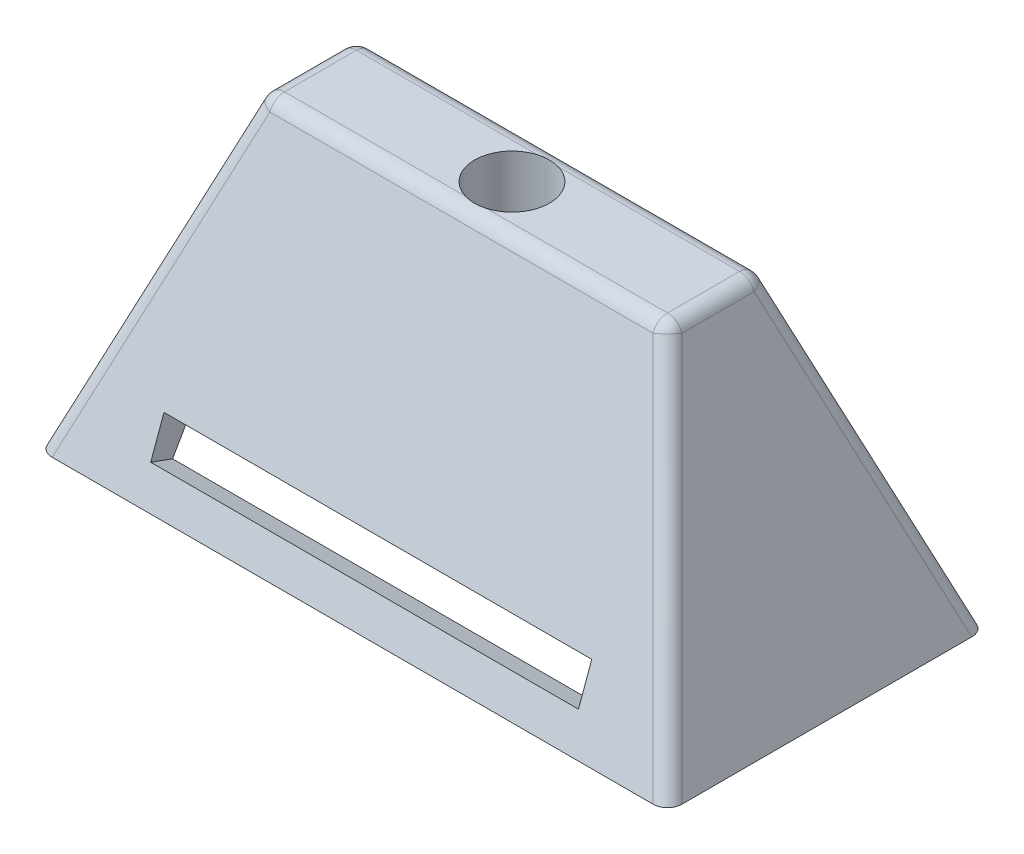
ISO-10303-21;
HEADER;
FILE_DESCRIPTION(('STEP AP214'),'2;1');
FILE_NAME('part.step','',(''),(''),'','','');
FILE_SCHEMA(('AUTOMOTIVE_DESIGN { 1 0 10303 214 1 1 1 1 }'));
ENDSEC;
DATA;
#1=APPLICATION_CONTEXT('core data for automotive mechanical design processes');
#2=APPLICATION_PROTOCOL_DEFINITION('international standard','automotive_design',2000,#1);
#3=PRODUCT_CONTEXT('',#1,'mechanical');
#4=PRODUCT('Part','Part','',(#3));
#5=PRODUCT_RELATED_PRODUCT_CATEGORY('part','',(#4));
#6=PRODUCT_DEFINITION_FORMATION('','',#4);
#7=PRODUCT_DEFINITION_CONTEXT('part definition',#1,'design');
#8=PRODUCT_DEFINITION('design','',#6,#7);
#9=PRODUCT_DEFINITION_SHAPE('','',#8);
#10=(LENGTH_UNIT() NAMED_UNIT(*) SI_UNIT(.MILLI.,.METRE.));
#11=(NAMED_UNIT(*) PLANE_ANGLE_UNIT() SI_UNIT($,.RADIAN.));
#12=(NAMED_UNIT(*) SI_UNIT($,.STERADIAN.) SOLID_ANGLE_UNIT());
#13=UNCERTAINTY_MEASURE_WITH_UNIT(LENGTH_MEASURE(1.E-05),#10,'distance_accuracy_value','');
#14=(GEOMETRIC_REPRESENTATION_CONTEXT(3) GLOBAL_UNCERTAINTY_ASSIGNED_CONTEXT((#13)) GLOBAL_UNIT_ASSIGNED_CONTEXT((#10,
#11,#12)) REPRESENTATION_CONTEXT('',''));
#15=CARTESIAN_POINT('',(0.,0.,0.));
#16=DIRECTION('',(0.,0.,1.));
#17=DIRECTION('',(1.,0.,0.));
#18=AXIS2_PLACEMENT_3D('',#15,#16,#17);
#19=CARTESIAN_POINT('',(0.,50.5,0.));
#20=DIRECTION('',(0.,-1.,0.));
#21=DIRECTION('',(0.,0.,-1.));
#22=AXIS2_PLACEMENT_3D('',#19,#20,#21);
#23=PLANE('',#22);
#24=CARTESIAN_POINT('',(0.,50.5,0.));
#25=DIRECTION('',(0.,1.,0.));
#26=DIRECTION('',(0.,0.,1.));
#27=AXIS2_PLACEMENT_3D('',#24,#25,#26);
#28=CIRCLE('',#27,6.115);
#29=CARTESIAN_POINT('',(1.69296508616016,50.5,5.87597602250407));
#30=VERTEX_POINT('',#29);
#31=CARTESIAN_POINT('',(1.69296508616016,50.5,-5.87597602250407));
#32=VERTEX_POINT('',#31);
#33=EDGE_CURVE('E306',#30,#32,#28,.T.);
#34=ORIENTED_EDGE('',*,*,#33,.F.);
#35=DIRECTION('',(-1.,0.,0.));
#36=VECTOR('',#35,1.);
#37=CARTESIAN_POINT('',(0.,50.5,5.87597602250407));
#38=LINE('',#37,#36);
#39=CARTESIAN_POINT('',(31.2759760225041,50.5,5.87597602250408));
#40=VERTEX_POINT('',#39);
#41=EDGE_CURVE('E375',#30,#40,#38,.F.);
#42=ORIENTED_EDGE('',*,*,#41,.T.);
#43=DIRECTION('',(0.,0.,1.));
#44=VECTOR('',#43,1.);
#45=CARTESIAN_POINT('',(31.2759760225041,50.5,0.));
#46=LINE('',#45,#44);
#47=CARTESIAN_POINT('',(31.2759760225041,50.5,-5.87597602250407));
#48=VERTEX_POINT('',#47);
#49=EDGE_CURVE('E372',#40,#48,#46,.F.);
#50=ORIENTED_EDGE('',*,*,#49,.T.);
#51=DIRECTION('',(1.,0.,0.));
#52=VECTOR('',#51,1.);
#53=CARTESIAN_POINT('',(0.,50.5,-5.87597602250407));
#54=LINE('',#53,#52);
#55=EDGE_CURVE('E370',#48,#32,#54,.F.);
#56=ORIENTED_EDGE('',*,*,#55,.T.);
#57=EDGE_LOOP('',(#34,#42,#50,#56));
#58=FACE_BOUND('',#57,.T.);
#59=ADVANCED_FACE('F46',(#58),#23,.F.);
#60=CARTESIAN_POINT('',(51.435,0.,26.035));
#61=DIRECTION('',(0.939692620785908,0.342020143325669,0.));
#62=DIRECTION('',(-0.342020143325669,0.939692620785908,0.));
#63=AXIS2_PLACEMENT_3D('',#60,#61,#62);
#64=PLANE('',#63);
#65=DIRECTION('',(-0.323615577118185,0.889126490715988,0.323615577118185));
#66=VECTOR('',#65,1.);
#67=CARTESIAN_POINT('',(46.231827455858,14.2955990745563,-18.4450081990618));
#68=LINE('',#67,#66);
#69=CARTESIAN_POINT('',(51.435,0.,-23.6481807432038));
#70=VERTEX_POINT('',#69);
#71=CARTESIAN_POINT('',(33.6627952793003,48.8287311640472,-5.87597602250406));
#72=VERTEX_POINT('',#71);
#73=EDGE_CURVE('E346',#70,#72,#68,.T.);
#74=ORIENTED_EDGE('',*,*,#73,.T.);
#75=DIRECTION('',(0.,0.,-1.));
#76=VECTOR('',#75,1.);
#77=CARTESIAN_POINT('',(33.6627952793003,48.8287311640472,26.035));
#78=LINE('',#77,#76);
#79=CARTESIAN_POINT('',(33.6627952793003,48.8287311640472,5.87597602250406));
#80=VERTEX_POINT('',#79);
#81=EDGE_CURVE('E377',#72,#80,#78,.F.);
#82=ORIENTED_EDGE('',*,*,#81,.T.);
#83=DIRECTION('',(-0.323615577118185,0.889126490715988,-0.323615577118185));
#84=VECTOR('',#83,1.);
#85=CARTESIAN_POINT('',(51.6849645199646,-0.686771874267663,23.8981452631684));
#86=LINE('',#85,#84);
#87=CARTESIAN_POINT('',(51.435,0.,23.6481807432038));
#88=VERTEX_POINT('',#87);
#89=EDGE_CURVE('E344',#80,#88,#86,.F.);
#90=ORIENTED_EDGE('',*,*,#89,.T.);
#91=DIRECTION('',(0.,0.,-1.));
#92=VECTOR('',#91,1.);
#93=CARTESIAN_POINT('',(51.435,0.,26.035));
#94=LINE('',#93,#92);
#95=EDGE_CURVE('E309',#88,#70,#94,.T.);
#96=ORIENTED_EDGE('',*,*,#95,.T.);
#97=EDGE_LOOP('',(#74,#82,#90,#96));
#98=FACE_BOUND('',#97,.T.);
#99=ADVANCED_FACE('F419',(#98),#64,.T.);
#100=CARTESIAN_POINT('',(-51.435,0.,-26.035));
#101=DIRECTION('',(0.,0.342020143325669,-0.939692620785908));
#102=DIRECTION('',(0.,0.939692620785908,0.342020143325669));
#103=AXIS2_PLACEMENT_3D('',#100,#101,#102);
#104=PLANE('',#103);
#105=DIRECTION('',(1.,0.,0.));
#106=VECTOR('',#105,1.);
#107=CARTESIAN_POINT('',(34.925,11.3510117800898,-21.9035695832423));
#108=LINE('',#107,#106);
#109=CARTESIAN_POINT('',(-34.925,11.3510117800898,-21.9035695832423));
#110=VERTEX_POINT('',#109);
#111=CARTESIAN_POINT('',(34.925,11.3510117800898,-21.9035695832423));
#112=VERTEX_POINT('',#111);
#113=EDGE_CURVE('E255',#110,#112,#108,.T.);
#114=ORIENTED_EDGE('',*,*,#113,.F.);
#115=DIRECTION('',(0.,0.939692620785908,0.34202014332567));
#116=VECTOR('',#115,1.);
#117=CARTESIAN_POINT('',(-34.925,5.38396363809928,-24.0753974933603));
#118=LINE('',#117,#116);
#119=CARTESIAN_POINT('',(-34.925,5.38396363809928,-24.0753974933603));
#120=VERTEX_POINT('',#119);
#121=EDGE_CURVE('E251',#120,#110,#118,.T.);
#122=ORIENTED_EDGE('',*,*,#121,.F.);
#123=DIRECTION('',(-1.,0.,0.));
#124=VECTOR('',#123,1.);
#125=CARTESIAN_POINT('',(34.925,5.38396363809928,-24.0753974933603));
#126=LINE('',#125,#124);
#127=CARTESIAN_POINT('',(34.925,5.38396363809928,-24.0753974933603));
#128=VERTEX_POINT('',#127);
#129=EDGE_CURVE('E261',#128,#120,#126,.T.);
#130=ORIENTED_EDGE('',*,*,#129,.F.);
#131=DIRECTION('',(0.,-0.939692620785908,-0.34202014332567));
#132=VECTOR('',#131,1.);
#133=CARTESIAN_POINT('',(34.925,5.38396363809928,-24.0753974933603));
#134=LINE('',#133,#132);
#135=EDGE_CURVE('E258',#112,#128,#134,.T.);
#136=ORIENTED_EDGE('',*,*,#135,.F.);
#137=EDGE_LOOP('',(#114,#122,#130,#136));
#138=FACE_BOUND('',#137,.T.);
#139=DIRECTION('',(0.323615577118185,0.889126490715988,0.323615577118185));
#140=VECTOR('',#139,1.);
#141=CARTESIAN_POINT('',(-49.2981452631684,-0.686771874267664,-26.2849645199646));
#142=LINE('',#141,#140);
#143=CARTESIAN_POINT('',(-49.0481807432038,0.,-26.035));
#144=VERTEX_POINT('',#143);
#145=CARTESIAN_POINT('',(-31.2759760225041,48.8287311640472,-8.26279527930027));
#146=VERTEX_POINT('',#145);
#147=EDGE_CURVE('E331',#144,#146,#142,.T.);
#148=ORIENTED_EDGE('',*,*,#147,.T.);
#149=DIRECTION('',(-1.,0.,0.));
#150=VECTOR('',#149,1.);
#151=CARTESIAN_POINT('',(-51.435,48.8287311640472,-8.26279527930028));
#152=LINE('',#151,#150);
#153=CARTESIAN_POINT('',(31.2759760225041,48.8287311640472,-8.26279527930027));
#154=VERTEX_POINT('',#153);
#155=EDGE_CURVE('E589',#146,#154,#152,.F.);
#156=ORIENTED_EDGE('',*,*,#155,.T.);
#157=DIRECTION('',(-0.323615577118185,0.889126490715988,0.323615577118185));
#158=VECTOR('',#157,1.);
#159=CARTESIAN_POINT('',(38.5248744779822,28.9125463417017,-15.5116937347784));
#160=LINE('',#159,#158);
#161=CARTESIAN_POINT('',(49.0481807432038,0.,-26.035));
#162=VERTEX_POINT('',#161);
#163=EDGE_CURVE('E334',#154,#162,#160,.F.);
#164=ORIENTED_EDGE('',*,*,#163,.T.);
#165=DIRECTION('',(-1.,0.,0.));
#166=VECTOR('',#165,1.);
#167=CARTESIAN_POINT('',(-51.435,0.,-26.035));
#168=LINE('',#167,#166);
#169=EDGE_CURVE('E312',#162,#144,#168,.T.);
#170=ORIENTED_EDGE('',*,*,#169,.T.);
#171=EDGE_LOOP('',(#148,#156,#164,#170));
#172=FACE_BOUND('',#171,.T.);
#173=ADVANCED_FACE('F422',(#138,#172),#104,.T.);
#174=CARTESIAN_POINT('',(-51.435,0.,26.035));
#175=DIRECTION('',(-0.939692620785908,0.342020143325669,0.));
#176=DIRECTION('',(-0.342020143325669,-0.939692620785908,0.));
#177=AXIS2_PLACEMENT_3D('',#174,#175,#176);
#178=PLANE('',#177);
#179=DIRECTION('',(0.323615577118185,0.889126490715988,-0.323615577118185));
#180=VECTOR('',#179,1.);
#181=CARTESIAN_POINT('',(-51.6849645199646,-0.686771874267663,23.8981452631684));
#182=LINE('',#181,#180);
#183=CARTESIAN_POINT('',(-51.435,0.,23.6481807432038));
#184=VERTEX_POINT('',#183);
#185=CARTESIAN_POINT('',(-33.6627952793003,48.8287311640472,5.87597602250406));
#186=VERTEX_POINT('',#185);
#187=EDGE_CURVE('E356',#184,#186,#182,.T.);
#188=ORIENTED_EDGE('',*,*,#187,.T.);
#189=DIRECTION('',(0.,0.,1.));
#190=VECTOR('',#189,1.);
#191=CARTESIAN_POINT('',(-33.6627952793003,48.8287311640472,26.035));
#192=LINE('',#191,#190);
#193=CARTESIAN_POINT('',(-33.6627952793003,48.8287311640472,-5.87597602250407));
#194=VERTEX_POINT('',#193);
#195=EDGE_CURVE('E508',#186,#194,#192,.F.);
#196=ORIENTED_EDGE('',*,*,#195,.T.);
#197=DIRECTION('',(0.323615577118185,0.889126490715988,0.323615577118185));
#198=VECTOR('',#197,1.);
#199=CARTESIAN_POINT('',(-46.231827455858,14.2955990745563,-18.4450081990618));
#200=LINE('',#199,#198);
#201=CARTESIAN_POINT('',(-51.435,0.,-23.6481807432038));
#202=VERTEX_POINT('',#201);
#203=EDGE_CURVE('E354',#194,#202,#200,.F.);
#204=ORIENTED_EDGE('',*,*,#203,.T.);
#205=DIRECTION('',(0.,0.,1.));
#206=VECTOR('',#205,1.);
#207=CARTESIAN_POINT('',(-51.435,0.,26.035));
#208=LINE('',#207,#206);
#209=EDGE_CURVE('E315',#202,#184,#208,.T.);
#210=ORIENTED_EDGE('',*,*,#209,.T.);
#211=EDGE_LOOP('',(#188,#196,#204,#210));
#212=FACE_BOUND('',#211,.T.);
#213=ADVANCED_FACE('F426',(#212),#178,.T.);
#214=CARTESIAN_POINT('',(-51.435,0.,26.035));
#215=DIRECTION('',(0.,0.342020143325669,0.939692620785908));
#216=DIRECTION('',(0.,-0.939692620785908,0.342020143325669));
#217=AXIS2_PLACEMENT_3D('',#214,#215,#216);
#218=PLANE('',#217);
#219=DIRECTION('',(-1.,0.,0.));
#220=VECTOR('',#219,1.);
#221=CARTESIAN_POINT('',(-34.925,11.3510117800898,21.9035695832423));
#222=LINE('',#221,#220);
#223=CARTESIAN_POINT('',(34.925,11.3510117800898,21.9035695832423));
#224=VERTEX_POINT('',#223);
#225=CARTESIAN_POINT('',(-34.925,11.3510117800898,21.9035695832423));
#226=VERTEX_POINT('',#225);
#227=EDGE_CURVE('E237',#224,#226,#222,.T.);
#228=ORIENTED_EDGE('',*,*,#227,.F.);
#229=DIRECTION('',(0.,0.939692620785908,-0.34202014332567));
#230=VECTOR('',#229,1.);
#231=CARTESIAN_POINT('',(34.925,5.38396363809928,24.0753974933603));
#232=LINE('',#231,#230);
#233=CARTESIAN_POINT('',(34.925,5.38396363809928,24.0753974933603));
#234=VERTEX_POINT('',#233);
#235=EDGE_CURVE('E61',#234,#224,#232,.T.);
#236=ORIENTED_EDGE('',*,*,#235,.F.);
#237=DIRECTION('',(1.,0.,0.));
#238=VECTOR('',#237,1.);
#239=CARTESIAN_POINT('',(-34.925,5.38396363809928,24.0753974933603));
#240=LINE('',#239,#238);
#241=CARTESIAN_POINT('',(-34.925,5.38396363809928,24.0753974933603));
#242=VERTEX_POINT('',#241);
#243=EDGE_CURVE('E244',#242,#234,#240,.T.);
#244=ORIENTED_EDGE('',*,*,#243,.F.);
#245=DIRECTION('',(0.,-0.939692620785908,0.34202014332567));
#246=VECTOR('',#245,1.);
#247=CARTESIAN_POINT('',(-34.925,5.38396363809928,24.0753974933603));
#248=LINE('',#247,#246);
#249=EDGE_CURVE('E228',#226,#242,#248,.T.);
#250=ORIENTED_EDGE('',*,*,#249,.F.);
#251=EDGE_LOOP('',(#228,#236,#244,#250));
#252=FACE_BOUND('',#251,.T.);
#253=DIRECTION('',(-0.323615577118185,0.889126490715988,-0.323615577118185));
#254=VECTOR('',#253,1.);
#255=CARTESIAN_POINT('',(38.5248744779821,28.9125463417017,15.5116937347784));
#256=LINE('',#255,#254);
#257=CARTESIAN_POINT('',(49.0481807432038,0.,26.035));
#258=VERTEX_POINT('',#257);
#259=CARTESIAN_POINT('',(31.275976022504,48.8287311640472,8.26279527930027));
#260=VERTEX_POINT('',#259);
#261=EDGE_CURVE('E351',#258,#260,#256,.T.);
#262=ORIENTED_EDGE('',*,*,#261,.T.);
#263=DIRECTION('',(1.,0.,0.));
#264=VECTOR('',#263,1.);
#265=CARTESIAN_POINT('',(-51.435,48.8287311640472,8.26279527930028));
#266=LINE('',#265,#264);
#267=CARTESIAN_POINT('',(-31.2759760225041,48.8287311640472,8.26279527930027));
#268=VERTEX_POINT('',#267);
#269=EDGE_CURVE('E481',#260,#268,#266,.F.);
#270=ORIENTED_EDGE('',*,*,#269,.T.);
#271=DIRECTION('',(0.323615577118185,0.889126490715988,-0.323615577118185));
#272=VECTOR('',#271,1.);
#273=CARTESIAN_POINT('',(-49.2981452631684,-0.686771874267663,26.2849645199646));
#274=LINE('',#273,#272);
#275=CARTESIAN_POINT('',(-49.0481807432038,0.,26.035));
#276=VERTEX_POINT('',#275);
#277=EDGE_CURVE('E349',#268,#276,#274,.F.);
#278=ORIENTED_EDGE('',*,*,#277,.T.);
#279=DIRECTION('',(1.,0.,0.));
#280=VECTOR('',#279,1.);
#281=CARTESIAN_POINT('',(-51.435,0.,26.035));
#282=LINE('',#281,#280);
#283=EDGE_CURVE('E318',#276,#258,#282,.T.);
#284=ORIENTED_EDGE('',*,*,#283,.T.);
#285=EDGE_LOOP('',(#262,#270,#278,#284));
#286=FACE_BOUND('',#285,.T.);
#287=ADVANCED_FACE('F241',(#252,#286),#218,.T.);
#288=DIRECTION('',(0.,0.,-1.));
#289=VECTOR('',#288,1.);
#290=CARTESIAN_POINT('',(-31.2759760225041,50.5,0.));
#291=LINE('',#290,#289);
#292=CARTESIAN_POINT('',(-31.2759760225041,50.5,-5.87597602250407));
#293=VERTEX_POINT('',#292);
#294=CARTESIAN_POINT('',(-31.2759760225041,50.5,5.87597602250407));
#295=VERTEX_POINT('',#294);
#296=EDGE_CURVE('E364',#293,#295,#291,.F.);
#297=ORIENTED_EDGE('',*,*,#296,.T.);
#298=DIRECTION('',(-1.,0.,0.));
#299=VECTOR('',#298,1.);
#300=CARTESIAN_POINT('',(0.,50.5,5.87597602250407));
#301=LINE('',#300,#299);
#302=CARTESIAN_POINT('',(-1.69296508616016,50.5,5.87597602250407));
#303=VERTEX_POINT('',#302);
#304=EDGE_CURVE('E368',#295,#303,#301,.F.);
#305=ORIENTED_EDGE('',*,*,#304,.T.);
#306=CARTESIAN_POINT('',(-1.69296508616016,50.5,-5.87597602250407));
#307=VERTEX_POINT('',#306);
#308=EDGE_CURVE('E290',#307,#303,#28,.T.);
#309=ORIENTED_EDGE('',*,*,#308,.F.);
#310=DIRECTION('',(1.,0.,0.));
#311=VECTOR('',#310,1.);
#312=CARTESIAN_POINT('',(0.,50.5,-5.87597602250407));
#313=LINE('',#312,#311);
#314=EDGE_CURVE('E366',#307,#293,#313,.F.);
#315=ORIENTED_EDGE('',*,*,#314,.T.);
#316=EDGE_LOOP('',(#297,#305,#309,#315));
#317=FACE_BOUND('',#316,.T.);
#318=ADVANCED_FACE('F411',(#317),#23,.F.);
#319=CARTESIAN_POINT('',(0.,0.,0.));
#320=DIRECTION('',(0.,-1.,0.));
#321=DIRECTION('',(0.,0.,-1.));
#322=AXIS2_PLACEMENT_3D('',#319,#320,#321);
#323=PLANE('',#322);
#324=DIRECTION('',(0.,0.,1.));
#325=VECTOR('',#324,1.);
#326=CARTESIAN_POINT('',(48.26,0.,-22.86));
#327=LINE('',#326,#325);
#328=CARTESIAN_POINT('',(48.26,0.,-22.86));
#329=VERTEX_POINT('',#328);
#330=CARTESIAN_POINT('',(48.26,0.,22.86));
#331=VERTEX_POINT('',#330);
#332=EDGE_CURVE('E274',#329,#331,#327,.T.);
#333=ORIENTED_EDGE('',*,*,#332,.F.);
#334=DIRECTION('',(1.,0.,0.));
#335=VECTOR('',#334,1.);
#336=CARTESIAN_POINT('',(-48.26,0.,-22.86));
#337=LINE('',#336,#335);
#338=CARTESIAN_POINT('',(-48.26,0.,-22.86));
#339=VERTEX_POINT('',#338);
#340=EDGE_CURVE('E284',#339,#329,#337,.T.);
#341=ORIENTED_EDGE('',*,*,#340,.F.);
#342=DIRECTION('',(0.,0.,-1.));
#343=VECTOR('',#342,1.);
#344=CARTESIAN_POINT('',(-48.26,0.,-22.86));
#345=LINE('',#344,#343);
#346=CARTESIAN_POINT('',(-48.26,0.,22.86));
#347=VERTEX_POINT('',#346);
#348=EDGE_CURVE('E281',#347,#339,#345,.T.);
#349=ORIENTED_EDGE('',*,*,#348,.F.);
#350=DIRECTION('',(-1.,0.,0.));
#351=VECTOR('',#350,1.);
#352=CARTESIAN_POINT('',(-48.26,0.,22.86));
#353=LINE('',#352,#351);
#354=EDGE_CURVE('E277',#331,#347,#353,.T.);
#355=ORIENTED_EDGE('',*,*,#354,.F.);
#356=EDGE_LOOP('',(#333,#341,#349,#355));
#357=FACE_BOUND('',#356,.T.);
#358=ORIENTED_EDGE('',*,*,#169,.F.);
#359=CARTESIAN_POINT('',(48.7319884579112,0.,-23.3319884579112));
#360=DIRECTION('',(0.,-1.,0.));
#361=DIRECTION('',(0.707106781186548,0.,-0.707106781186548));
#362=AXIS2_PLACEMENT_3D('',#359,#360,#361);
#363=ELLIPSE('',#362,2.85673638849137,2.54);
#364=EDGE_CURVE('E342',#162,#70,#363,.T.);
#365=ORIENTED_EDGE('',*,*,#364,.T.);
#366=ORIENTED_EDGE('',*,*,#95,.F.);
#367=CARTESIAN_POINT('',(48.7319884579112,0.,23.3319884579112));
#368=DIRECTION('',(0.,-1.,0.));
#369=DIRECTION('',(0.707106781186548,0.,0.707106781186548));
#370=AXIS2_PLACEMENT_3D('',#367,#368,#369);
#371=ELLIPSE('',#370,2.85673638849137,2.54);
#372=EDGE_CURVE('E340',#88,#258,#371,.T.);
#373=ORIENTED_EDGE('',*,*,#372,.T.);
#374=ORIENTED_EDGE('',*,*,#283,.F.);
#375=CARTESIAN_POINT('',(-48.7319884579112,0.,23.3319884579112));
#376=DIRECTION('',(0.,-1.,0.));
#377=DIRECTION('',(-0.707106781186548,0.,0.707106781186548));
#378=AXIS2_PLACEMENT_3D('',#375,#376,#377);
#379=ELLIPSE('',#378,2.85673638849137,2.54);
#380=EDGE_CURVE('E338',#276,#184,#379,.T.);
#381=ORIENTED_EDGE('',*,*,#380,.T.);
#382=ORIENTED_EDGE('',*,*,#209,.F.);
#383=CARTESIAN_POINT('',(-48.7319884579112,0.,-23.3319884579112));
#384=DIRECTION('',(0.,-1.,0.));
#385=DIRECTION('',(-0.707106781186548,0.,-0.707106781186548));
#386=AXIS2_PLACEMENT_3D('',#383,#384,#385);
#387=ELLIPSE('',#386,2.85673638849137,2.54);
#388=EDGE_CURVE('E336',#202,#144,#387,.T.);
#389=ORIENTED_EDGE('',*,*,#388,.T.);
#390=EDGE_LOOP('',(#358,#365,#366,#373,#374,#381,#382,#389));
#391=FACE_BOUND('',#390,.T.);
#392=ADVANCED_FACE('F408',(#357,#391),#323,.T.);
#393=CARTESIAN_POINT('',(0.,6.05000000000001,0.));
#394=DIRECTION('',(0.,1.,0.));
#395=DIRECTION('',(0.,0.,1.));
#396=AXIS2_PLACEMENT_3D('',#393,#394,#395);
#397=CYLINDRICAL_SURFACE('',#396,6.115);
#398=CARTESIAN_POINT('',(0.,39.5946814610244,0.));
#399=DIRECTION('',(0.,0.500000000000001,0.866025403784438));
#400=DIRECTION('',(0.,0.866025403784438,-0.500000000000001));
#401=AXIS2_PLACEMENT_3D('',#398,#399,#400);
#402=ELLIPSE('',#401,12.23,6.115);
#403=CARTESIAN_POINT('',(6.0538032764555,38.1,0.862954743875193));
#404=VERTEX_POINT('',#403);
#405=CARTESIAN_POINT('',(-6.0538032764555,38.1,0.862954743875193));
#406=VERTEX_POINT('',#405);
#407=EDGE_CURVE('E324',#404,#406,#402,.F.);
#408=ORIENTED_EDGE('',*,*,#407,.T.);
#409=CARTESIAN_POINT('',(0.,38.1,0.));
#410=DIRECTION('',(0.,1.,0.));
#411=DIRECTION('',(0.,0.,1.));
#412=AXIS2_PLACEMENT_3D('',#409,#410,#411);
#413=CIRCLE('',#412,6.115);
#414=CARTESIAN_POINT('',(-6.0538032764555,38.1,-0.862954743875193));
#415=VERTEX_POINT('',#414);
#416=EDGE_CURVE('E325',#406,#415,#413,.F.);
#417=ORIENTED_EDGE('',*,*,#416,.T.);
#418=CARTESIAN_POINT('',(0.,39.5946814610244,0.));
#419=DIRECTION('',(0.,0.500000000000001,-0.866025403784438));
#420=DIRECTION('',(0.,0.866025403784438,0.500000000000001));
#421=AXIS2_PLACEMENT_3D('',#418,#419,#420);
#422=ELLIPSE('',#421,12.23,6.115);
#423=CARTESIAN_POINT('',(6.0538032764555,38.1,-0.862954743875193));
#424=VERTEX_POINT('',#423);
#425=EDGE_CURVE('E328',#415,#424,#422,.F.);
#426=ORIENTED_EDGE('',*,*,#425,.T.);
#427=EDGE_CURVE('E321',#424,#404,#413,.F.);
#428=ORIENTED_EDGE('',*,*,#427,.T.);
#429=EDGE_LOOP('',(#408,#417,#426,#428));
#430=FACE_BOUND('',#429,.T.);
#431=ORIENTED_EDGE('',*,*,#308,.T.);
#432=CARTESIAN_POINT('',(-1.69296508616016,50.5,5.87597602250407));
#433=CARTESIAN_POINT('',(-1.60952443656501,50.4999925558622,5.90001776040481));
#434=CARTESIAN_POINT('',(-1.52557322320187,50.4996584658787,5.92227949645079));
#435=CARTESIAN_POINT('',(-1.3568027939252,50.4985861456086,5.96320780933541));
#436=CARTESIAN_POINT('',(-1.27198359260073,50.4978479221036,5.98187444649595));
#437=CARTESIAN_POINT('',(-1.10160816337273,50.4962162840063,6.01558204129442));
#438=CARTESIAN_POINT('',(-1.01605177250953,50.4953228342181,6.03062217480974));
#439=CARTESIAN_POINT('',(-0.844380748739116,50.4935720693259,6.05704471478893));
#440=CARTESIAN_POINT('',(-0.758266113438975,50.492714754377,6.06842710556323));
#441=CARTESIAN_POINT('',(-0.503297468344232,50.4904720833109,6.09661310097054));
#442=CARTESIAN_POINT('',(-0.333839197574481,50.4893626179724,6.10823828101187));
#443=CARTESIAN_POINT('',(0.00539773065622829,50.488509270714,6.11735071111846));
#444=CARTESIAN_POINT('',(0.175176263072801,50.4887649355502,6.11484265361795));
#445=CARTESIAN_POINT('',(0.457688660694975,50.4902043043048,6.09890138968219));
#446=CARTESIAN_POINT('',(0.570658367018062,50.4910519295101,6.08936936474626));
#447=CARTESIAN_POINT('',(0.795888657786353,50.4930599419167,6.0640437044004));
#448=CARTESIAN_POINT('',(0.908149289308577,50.4942203081264,6.04825048921976));
#449=CARTESIAN_POINT('',(1.13337583054193,50.4965279851074,6.0101523192142));
#450=CARTESIAN_POINT('',(1.24632508390702,50.4976748038704,5.98774889911868));
#451=CARTESIAN_POINT('',(1.47080412419477,50.4993990715915,5.93660051168935));
#452=CARTESIAN_POINT('',(1.58233364749404,50.4999764162859,5.90785438426246));
#453=CARTESIAN_POINT('',(1.69296508616016,50.5,5.87597602250407));
#454=B_SPLINE_CURVE_WITH_KNOTS('',3,(#432,#433,#434,#435,#436,#437,#438,#439,#440,#441,#442,
#443,#444,#445,#446,#447,#448,#449,#450,#451,#452,#453),.UNSPECIFIED.,.F.,.F.,(4,2,2,2,2,2,2,2,
2,2,4),(0.,0.26048179030019,0.520959209614761,0.781495766728189,1.04203344137613,
1.55097958146913,2.05975675422242,2.39971754208422,2.73965551682409,3.08493751531033,
3.43028271894987),.UNSPECIFIED.);
#455=EDGE_CURVE('E391',#303,#30,#454,.T.);
#456=ORIENTED_EDGE('',*,*,#455,.T.);
#457=ORIENTED_EDGE('',*,*,#33,.T.);
#458=CARTESIAN_POINT('',(1.69296508616016,50.5,-5.87597602250407));
#459=CARTESIAN_POINT('',(1.60952443656501,50.4999925558622,-5.90001776040481));
#460=CARTESIAN_POINT('',(1.52557322320187,50.4996584658787,-5.92227949645079));
#461=CARTESIAN_POINT('',(1.3568027939252,50.4985861456086,-5.96320780933541));
#462=CARTESIAN_POINT('',(1.27198359260073,50.4978479221036,-5.98187444649595));
#463=CARTESIAN_POINT('',(1.10160816337273,50.4962162840063,-6.01558204129442));
#464=CARTESIAN_POINT('',(1.01605177250953,50.4953228342181,-6.03062217480974));
#465=CARTESIAN_POINT('',(0.844380748739116,50.4935720693259,-6.05704471478893));
#466=CARTESIAN_POINT('',(0.758266113438975,50.492714754377,-6.06842710556323));
#467=CARTESIAN_POINT('',(0.503297468344232,50.4904720833109,-6.09661310097054));
#468=CARTESIAN_POINT('',(0.333839197574481,50.4893626179724,-6.10823828101187));
#469=CARTESIAN_POINT('',(-0.00539773065622829,50.488509270714,-6.11735071111846));
#470=CARTESIAN_POINT('',(-0.175176263072801,50.4887649355502,-6.11484265361795));
#471=CARTESIAN_POINT('',(-0.457688660694975,50.4902043043048,-6.09890138968219));
#472=CARTESIAN_POINT('',(-0.570658367018062,50.4910519295101,-6.08936936474626));
#473=CARTESIAN_POINT('',(-0.795888657786353,50.4930599419167,-6.0640437044004));
#474=CARTESIAN_POINT('',(-0.908149289308577,50.4942203081264,-6.04825048921976));
#475=CARTESIAN_POINT('',(-1.13337583054193,50.4965279851074,-6.0101523192142));
#476=CARTESIAN_POINT('',(-1.24632508390702,50.4976748038704,-5.98774889911868));
#477=CARTESIAN_POINT('',(-1.47080412419477,50.4993990715915,-5.93660051168935));
#478=CARTESIAN_POINT('',(-1.58233364749404,50.4999764162859,-5.90785438426246));
#479=CARTESIAN_POINT('',(-1.69296508616016,50.5,-5.87597602250407));
#480=B_SPLINE_CURVE_WITH_KNOTS('',3,(#458,#459,#460,#461,#462,#463,#464,#465,#466,#467,#468,
#469,#470,#471,#472,#473,#474,#475,#476,#477,#478,#479),.UNSPECIFIED.,.F.,.F.,(4,2,2,2,2,2,2,2,
2,2,4),(0.,0.26048179030019,0.520959209614761,0.781495766728189,1.04203344137613,
1.55097958146913,2.05975675422242,2.39971754208422,2.73965551682409,3.08493751531033,
3.43028271894987),.UNSPECIFIED.);
#481=EDGE_CURVE('E383',#32,#307,#480,.T.);
#482=ORIENTED_EDGE('',*,*,#481,.T.);
#483=EDGE_LOOP('',(#431,#456,#457,#482));
#484=FACE_BOUND('',#483,.T.);
#485=ADVANCED_FACE('F402',(#430,#484),#397,.F.);
#486=CARTESIAN_POINT('',(-48.26,0.,-22.86));
#487=DIRECTION('',(0.,0.500000000000001,-0.866025403784438));
#488=DIRECTION('',(0.,0.866025403784438,0.500000000000001));
#489=AXIS2_PLACEMENT_3D('',#486,#487,#488);
#490=PLANE('',#489);
#491=DIRECTION('',(-1.,0.,0.));
#492=VECTOR('',#491,1.);
#493=CARTESIAN_POINT('',(-48.26,4.08349613901899,-20.5023924049026));
#494=LINE('',#493,#492);
#495=CARTESIAN_POINT('',(34.925,4.08349613901899,-20.5023924049026));
#496=VERTEX_POINT('',#495);
#497=CARTESIAN_POINT('',(-34.925,4.08349613901899,-20.5023924049026));
#498=VERTEX_POINT('',#497);
#499=EDGE_CURVE('E511',#496,#498,#494,.T.);
#500=ORIENTED_EDGE('',*,*,#499,.T.);
#501=DIRECTION('',(0.,0.866025403784438,0.500000000000001));
#502=VECTOR('',#501,1.);
#503=CARTESIAN_POINT('',(-34.925,0.,-22.86));
#504=LINE('',#503,#502);
#505=CARTESIAN_POINT('',(-34.925,9.66759242300003,-17.2784129121653));
#506=VERTEX_POINT('',#505);
#507=EDGE_CURVE('E514',#498,#506,#504,.T.);
#508=ORIENTED_EDGE('',*,*,#507,.T.);
#509=DIRECTION('',(1.,0.,0.));
#510=VECTOR('',#509,1.);
#511=CARTESIAN_POINT('',(-48.26,9.66759242300003,-17.2784129121653));
#512=LINE('',#511,#510);
#513=CARTESIAN_POINT('',(34.925,9.66759242300003,-17.2784129121653));
#514=VERTEX_POINT('',#513);
#515=EDGE_CURVE('E504',#506,#514,#512,.T.);
#516=ORIENTED_EDGE('',*,*,#515,.T.);
#517=DIRECTION('',(0.,-0.866025403784438,-0.500000000000001));
#518=VECTOR('',#517,1.);
#519=CARTESIAN_POINT('',(34.925,0.,-22.86));
#520=LINE('',#519,#518);
#521=EDGE_CURVE('E507',#514,#496,#520,.T.);
#522=ORIENTED_EDGE('',*,*,#521,.T.);
#523=EDGE_LOOP('',(#500,#508,#516,#522));
#524=FACE_BOUND('',#523,.T.);
#525=DIRECTION('',(0.447213595499959,-0.774596669241482,-0.447213595499959));
#526=VECTOR('',#525,1.);
#527=CARTESIAN_POINT('',(28.9559999999999,33.4355087893096,-3.55599999999993));
#528=LINE('',#527,#526);
#529=CARTESIAN_POINT('',(26.996189585746,36.83,-1.59618958574602));
#530=VERTEX_POINT('',#529);
#531=EDGE_CURVE('E288',#530,#329,#528,.T.);
#532=ORIENTED_EDGE('',*,*,#531,.F.);
#533=CARTESIAN_POINT('',(24.7964850601336,35.56,-2.32942442761685));
#534=DIRECTION('',(0.,0.500000000000001,-0.866025403784438));
#535=DIRECTION('',(0.,-0.866025403784438,-0.500000000000001));
#536=AXIS2_PLACEMENT_3D('',#533,#534,#535);
#537=ELLIPSE('',#536,2.9329393674833,2.54);
#538=CARTESIAN_POINT('',(24.7964850601336,38.1,-0.862954743875193));
#539=VERTEX_POINT('',#538);
#540=EDGE_CURVE('E587',#530,#539,#537,.F.);
#541=ORIENTED_EDGE('',*,*,#540,.T.);
#542=DIRECTION('',(1.,0.,0.));
#543=VECTOR('',#542,1.);
#544=CARTESIAN_POINT('',(-48.26,38.1,-0.862954743875193));
#545=LINE('',#544,#543);
#546=EDGE_CURVE('E300',#424,#539,#545,.T.);
#547=ORIENTED_EDGE('',*,*,#546,.F.);
#548=ORIENTED_EDGE('',*,*,#425,.F.);
#549=CARTESIAN_POINT('',(-26.2629547438752,38.1,-0.862954743875193));
#550=VERTEX_POINT('',#549);
#551=EDGE_CURVE('E295',#550,#415,#545,.T.);
#552=ORIENTED_EDGE('',*,*,#551,.F.);
#553=DIRECTION('',(-0.447213595499959,-0.774596669241482,-0.447213595499959));
#554=VECTOR('',#553,1.);
#555=CARTESIAN_POINT('',(-48.26,0.,-22.86));
#556=LINE('',#555,#554);
#557=EDGE_CURVE('E291',#550,#339,#556,.T.);
#558=ORIENTED_EDGE('',*,*,#557,.T.);
#559=ORIENTED_EDGE('',*,*,#340,.T.);
#560=EDGE_LOOP('',(#532,#541,#547,#548,#552,#558,#559));
#561=FACE_BOUND('',#560,.T.);
#562=ADVANCED_FACE('F407',(#524,#561),#490,.F.);
#563=CARTESIAN_POINT('',(-48.26,0.,22.86));
#564=DIRECTION('',(0.,0.500000000000001,0.866025403784438));
#565=DIRECTION('',(0.,-0.866025403784438,0.500000000000001));
#566=AXIS2_PLACEMENT_3D('',#563,#564,#565);
#567=PLANE('',#566);
#568=DIRECTION('',(1.,0.,0.));
#569=VECTOR('',#568,1.);
#570=CARTESIAN_POINT('',(-48.26,4.08349613901899,20.5023924049026));
#571=LINE('',#570,#569);
#572=CARTESIAN_POINT('',(-34.925,4.08349613901899,20.5023924049026));
#573=VERTEX_POINT('',#572);
#574=CARTESIAN_POINT('',(34.925,4.08349613901899,20.5023924049026));
#575=VERTEX_POINT('',#574);
#576=EDGE_CURVE('E54',#573,#575,#571,.T.);
#577=ORIENTED_EDGE('',*,*,#576,.T.);
#578=DIRECTION('',(0.,0.866025403784438,-0.500000000000001));
#579=VECTOR('',#578,1.);
#580=CARTESIAN_POINT('',(34.925,0.,22.86));
#581=LINE('',#580,#579);
#582=CARTESIAN_POINT('',(34.925,9.66759242300003,17.2784129121653));
#583=VERTEX_POINT('',#582);
#584=EDGE_CURVE('E11',#575,#583,#581,.T.);
#585=ORIENTED_EDGE('',*,*,#584,.T.);
#586=DIRECTION('',(-1.,0.,0.));
#587=VECTOR('',#586,1.);
#588=CARTESIAN_POINT('',(-48.26,9.66759242300003,17.2784129121653));
#589=LINE('',#588,#587);
#590=CARTESIAN_POINT('',(-34.925,9.66759242300003,17.2784129121653));
#591=VERTEX_POINT('',#590);
#592=EDGE_CURVE('E517',#583,#591,#589,.T.);
#593=ORIENTED_EDGE('',*,*,#592,.T.);
#594=DIRECTION('',(0.,-0.866025403784438,0.500000000000001));
#595=VECTOR('',#594,1.);
#596=CARTESIAN_POINT('',(-34.925,0.,22.86));
#597=LINE('',#596,#595);
#598=EDGE_CURVE('E231',#591,#573,#597,.T.);
#599=ORIENTED_EDGE('',*,*,#598,.T.);
#600=EDGE_LOOP('',(#577,#585,#593,#599));
#601=FACE_BOUND('',#600,.T.);
#602=DIRECTION('',(-1.,0.,0.));
#603=VECTOR('',#602,1.);
#604=CARTESIAN_POINT('',(-48.26,38.1,0.862954743875193));
#605=LINE('',#604,#603);
#606=CARTESIAN_POINT('',(24.7964850601336,38.1,0.862954743875193));
#607=VERTEX_POINT('',#606);
#608=EDGE_CURVE('E304',#607,#404,#605,.T.);
#609=ORIENTED_EDGE('',*,*,#608,.F.);
#610=CARTESIAN_POINT('',(24.7964850601336,35.56,2.32942442761685));
#611=DIRECTION('',(0.,0.500000000000001,0.866025403784438));
#612=DIRECTION('',(0.,0.866025403784438,-0.500000000000001));
#613=AXIS2_PLACEMENT_3D('',#610,#611,#612);
#614=ELLIPSE('',#613,2.9329393674833,2.54);
#615=CARTESIAN_POINT('',(26.996189585746,36.83,1.59618958574602));
#616=VERTEX_POINT('',#615);
#617=EDGE_CURVE('E583',#607,#616,#614,.F.);
#618=ORIENTED_EDGE('',*,*,#617,.T.);
#619=DIRECTION('',(0.447213595499959,-0.774596669241482,0.447213595499959));
#620=VECTOR('',#619,1.);
#621=CARTESIAN_POINT('',(39.116,15.8378725844098,13.716));
#622=LINE('',#621,#620);
#623=EDGE_CURVE('E292',#616,#331,#622,.T.);
#624=ORIENTED_EDGE('',*,*,#623,.T.);
#625=ORIENTED_EDGE('',*,*,#354,.T.);
#626=DIRECTION('',(-0.447213595499959,-0.774596669241482,0.447213595499959));
#627=VECTOR('',#626,1.);
#628=CARTESIAN_POINT('',(-48.26,0.,22.86));
#629=LINE('',#628,#627);
#630=CARTESIAN_POINT('',(-26.2629547438752,38.1,0.862954743875193));
#631=VERTEX_POINT('',#630);
#632=EDGE_CURVE('E294',#631,#347,#629,.T.);
#633=ORIENTED_EDGE('',*,*,#632,.F.);
#634=EDGE_CURVE('E287',#406,#631,#605,.T.);
#635=ORIENTED_EDGE('',*,*,#634,.F.);
#636=ORIENTED_EDGE('',*,*,#407,.F.);
#637=EDGE_LOOP('',(#609,#618,#624,#625,#633,#635,#636));
#638=FACE_BOUND('',#637,.T.);
#639=ADVANCED_FACE('F521',(#601,#638),#567,.F.);
#640=CARTESIAN_POINT('',(0.,38.1,0.));
#641=DIRECTION('',(0.,1.,0.));
#642=DIRECTION('',(0.,0.,1.));
#643=AXIS2_PLACEMENT_3D('',#640,#641,#642);
#644=PLANE('',#643);
#645=ORIENTED_EDGE('',*,*,#634,.T.);
#646=DIRECTION('',(0.,0.,-1.));
#647=VECTOR('',#646,1.);
#648=CARTESIAN_POINT('',(-26.2629547438752,38.1,-22.86));
#649=LINE('',#648,#647);
#650=EDGE_CURVE('E301',#631,#550,#649,.T.);
#651=ORIENTED_EDGE('',*,*,#650,.T.);
#652=ORIENTED_EDGE('',*,*,#551,.T.);
#653=ORIENTED_EDGE('',*,*,#416,.F.);
#654=EDGE_LOOP('',(#645,#651,#652,#653));
#655=FACE_BOUND('',#654,.T.);
#656=ADVANCED_FACE('F553',(#655),#644,.F.);
#657=ORIENTED_EDGE('',*,*,#546,.T.);
#658=DIRECTION('',(0.,0.,1.));
#659=VECTOR('',#658,1.);
#660=CARTESIAN_POINT('',(24.7964850601336,38.1,0.862954743875193));
#661=LINE('',#660,#659);
#662=EDGE_CURVE('E591',#539,#607,#661,.T.);
#663=ORIENTED_EDGE('',*,*,#662,.T.);
#664=ORIENTED_EDGE('',*,*,#608,.T.);
#665=ORIENTED_EDGE('',*,*,#427,.F.);
#666=EDGE_LOOP('',(#657,#663,#664,#665));
#667=FACE_BOUND('',#666,.T.);
#668=ADVANCED_FACE('F556',(#667),#644,.F.);
#669=CARTESIAN_POINT('',(48.26,0.,-22.86));
#670=DIRECTION('',(0.866025403784438,0.500000000000001,0.));
#671=DIRECTION('',(-0.500000000000001,0.866025403784438,0.));
#672=AXIS2_PLACEMENT_3D('',#669,#670,#671);
#673=PLANE('',#672);
#674=ORIENTED_EDGE('',*,*,#623,.F.);
#675=DIRECTION('',(0.,0.,1.));
#676=VECTOR('',#675,1.);
#677=CARTESIAN_POINT('',(26.996189585746,36.83,-0.862954743875193));
#678=LINE('',#677,#676);
#679=EDGE_CURVE('E585',#616,#530,#678,.F.);
#680=ORIENTED_EDGE('',*,*,#679,.T.);
#681=ORIENTED_EDGE('',*,*,#531,.T.);
#682=ORIENTED_EDGE('',*,*,#332,.T.);
#683=EDGE_LOOP('',(#674,#680,#681,#682));
#684=FACE_BOUND('',#683,.T.);
#685=ADVANCED_FACE('F558',(#684),#673,.F.);
#686=CARTESIAN_POINT('',(-48.26,0.,-22.86));
#687=DIRECTION('',(-0.866025403784438,0.500000000000001,0.));
#688=DIRECTION('',(-0.500000000000001,-0.866025403784438,0.));
#689=AXIS2_PLACEMENT_3D('',#686,#687,#688);
#690=PLANE('',#689);
#691=ORIENTED_EDGE('',*,*,#348,.T.);
#692=ORIENTED_EDGE('',*,*,#557,.F.);
#693=ORIENTED_EDGE('',*,*,#650,.F.);
#694=ORIENTED_EDGE('',*,*,#632,.T.);
#695=EDGE_LOOP('',(#691,#692,#693,#694));
#696=FACE_BOUND('',#695,.T.);
#697=ADVANCED_FACE('F437',(#696),#690,.F.);
#698=CARTESIAN_POINT('',(38.5248744779822,28.0438151776545,-13.1248744779822));
#699=DIRECTION('',(0.323615577118185,-0.889126490715988,-0.323615577118185));
#700=DIRECTION('',(0.,0.342020143325669,-0.939692620785908));
#701=AXIS2_PLACEMENT_3D('',#698,#699,#700);
#702=CYLINDRICAL_SURFACE('',#701,2.54);
#703=ORIENTED_EDGE('',*,*,#163,.F.);
#704=CARTESIAN_POINT('',(31.2759760225041,47.96,-5.87597602250407));
#705=DIRECTION('',(0.323615577118185,-0.889126490715988,-0.323615577118185));
#706=DIRECTION('',(0.,0.342020143325669,-0.939692620785908));
#707=AXIS2_PLACEMENT_3D('',#704,#705,#706);
#708=CIRCLE('',#707,2.54);
#709=EDGE_CURVE('E362',#154,#72,#708,.T.);
#710=ORIENTED_EDGE('',*,*,#709,.T.);
#711=ORIENTED_EDGE('',*,*,#73,.F.);
#712=ORIENTED_EDGE('',*,*,#364,.F.);
#713=EDGE_LOOP('',(#703,#710,#711,#712));
#714=FACE_BOUND('',#713,.T.);
#715=ADVANCED_FACE('F433',(#714),#702,.T.);
#716=CARTESIAN_POINT('',(49.2981452631684,-1.55550303831486,23.8981452631684));
#717=DIRECTION('',(0.323615577118185,-0.889126490715988,0.323615577118185));
#718=DIRECTION('',(0.,-0.342020143325669,-0.939692620785908));
#719=AXIS2_PLACEMENT_3D('',#716,#717,#718);
#720=CYLINDRICAL_SURFACE('',#719,2.54);
#721=ORIENTED_EDGE('',*,*,#89,.F.);
#722=CARTESIAN_POINT('',(31.2759760225041,47.96,5.87597602250407));
#723=DIRECTION('',(0.323615577118185,-0.889126490715988,0.323615577118185));
#724=DIRECTION('',(0.,-0.342020143325669,-0.939692620785908));
#725=AXIS2_PLACEMENT_3D('',#722,#723,#724);
#726=CIRCLE('',#725,2.54);
#727=EDGE_CURVE('E379',#80,#260,#726,.T.);
#728=ORIENTED_EDGE('',*,*,#727,.T.);
#729=ORIENTED_EDGE('',*,*,#261,.F.);
#730=ORIENTED_EDGE('',*,*,#372,.F.);
#731=EDGE_LOOP('',(#721,#728,#729,#730));
#732=FACE_BOUND('',#731,.T.);
#733=ADVANCED_FACE('F436',(#732),#720,.T.);
#734=CARTESIAN_POINT('',(-49.2981452631684,-1.55550303831486,23.8981452631684));
#735=DIRECTION('',(-0.323615577118185,-0.889126490715988,0.323615577118185));
#736=DIRECTION('',(0.,-0.342020143325669,-0.939692620785908));
#737=AXIS2_PLACEMENT_3D('',#734,#735,#736);
#738=CYLINDRICAL_SURFACE('',#737,2.54);
#739=ORIENTED_EDGE('',*,*,#277,.F.);
#740=CARTESIAN_POINT('',(-31.2759760225041,47.96,5.87597602250407));
#741=DIRECTION('',(-0.323615577118185,-0.889126490715988,0.323615577118185));
#742=DIRECTION('',(0.,-0.342020143325669,-0.939692620785908));
#743=AXIS2_PLACEMENT_3D('',#740,#741,#742);
#744=CIRCLE('',#743,2.54);
#745=EDGE_CURVE('E381',#268,#186,#744,.T.);
#746=ORIENTED_EDGE('',*,*,#745,.T.);
#747=ORIENTED_EDGE('',*,*,#187,.F.);
#748=ORIENTED_EDGE('',*,*,#380,.F.);
#749=EDGE_LOOP('',(#739,#746,#747,#748));
#750=FACE_BOUND('',#749,.T.);
#751=ADVANCED_FACE('F441',(#750),#738,.T.);
#752=CARTESIAN_POINT('',(-43.8450081990618,13.4268679105091,-18.4450081990618));
#753=DIRECTION('',(-0.323615577118185,-0.889126490715988,-0.323615577118185));
#754=DIRECTION('',(0.,0.342020143325669,-0.939692620785908));
#755=AXIS2_PLACEMENT_3D('',#752,#753,#754);
#756=CYLINDRICAL_SURFACE('',#755,2.54);
#757=ORIENTED_EDGE('',*,*,#203,.F.);
#758=CARTESIAN_POINT('',(-31.2759760225041,47.96,-5.87597602250407));
#759=DIRECTION('',(-0.323615577118185,-0.889126490715988,-0.323615577118185));
#760=DIRECTION('',(0.,0.342020143325669,-0.939692620785908));
#761=AXIS2_PLACEMENT_3D('',#758,#759,#760);
#762=CIRCLE('',#761,2.54);
#763=EDGE_CURVE('E359',#194,#146,#762,.T.);
#764=ORIENTED_EDGE('',*,*,#763,.T.);
#765=ORIENTED_EDGE('',*,*,#147,.F.);
#766=ORIENTED_EDGE('',*,*,#388,.F.);
#767=EDGE_LOOP('',(#757,#764,#765,#766));
#768=FACE_BOUND('',#767,.T.);
#769=ADVANCED_FACE('F445',(#768),#756,.T.);
#770=CARTESIAN_POINT('',(31.2759760225041,47.96,5.87597602250407));
#771=DIRECTION('',(0.,-1.,0.));
#772=DIRECTION('',(0.,0.,-1.));
#773=AXIS2_PLACEMENT_3D('',#770,#771,#772);
#774=SPHERICAL_SURFACE('',#773,2.54);
#775=CARTESIAN_POINT('',(31.2759760225041,47.96,5.87597602250407));
#776=DIRECTION('',(-1.,0.,0.));
#777=DIRECTION('',(0.,0.,1.));
#778=AXIS2_PLACEMENT_3D('',#775,#776,#777);
#779=CIRCLE('',#778,2.54);
#780=EDGE_CURVE('E478',#260,#40,#779,.T.);
#781=ORIENTED_EDGE('',*,*,#780,.F.);
#782=ORIENTED_EDGE('',*,*,#727,.F.);
#783=CARTESIAN_POINT('',(31.2759760225041,47.96,5.87597602250407));
#784=DIRECTION('',(0.,0.,-1.));
#785=DIRECTION('',(-1.,0.,0.));
#786=AXIS2_PLACEMENT_3D('',#783,#784,#785);
#787=CIRCLE('',#786,2.54);
#788=EDGE_CURVE('E278',#40,#80,#787,.T.);
#789=ORIENTED_EDGE('',*,*,#788,.F.);
#790=EDGE_LOOP('',(#781,#782,#789));
#791=FACE_BOUND('',#790,.T.);
#792=ADVANCED_FACE('F449',(#791),#774,.T.);
#793=CARTESIAN_POINT('',(31.2759760225041,47.96,0.));
#794=DIRECTION('',(0.,0.,1.));
#795=DIRECTION('',(1.,0.,0.));
#796=AXIS2_PLACEMENT_3D('',#793,#794,#795);
#797=CYLINDRICAL_SURFACE('',#796,2.54);
#798=ORIENTED_EDGE('',*,*,#788,.T.);
#799=ORIENTED_EDGE('',*,*,#81,.F.);
#800=CARTESIAN_POINT('',(31.2759760225041,47.96,-5.87597602250407));
#801=DIRECTION('',(0.,0.,-1.));
#802=DIRECTION('',(-1.,0.,0.));
#803=AXIS2_PLACEMENT_3D('',#800,#801,#802);
#804=CIRCLE('',#803,2.54);
#805=EDGE_CURVE('E484',#48,#72,#804,.T.);
#806=ORIENTED_EDGE('',*,*,#805,.F.);
#807=ORIENTED_EDGE('',*,*,#49,.F.);
#808=EDGE_LOOP('',(#798,#799,#806,#807));
#809=FACE_BOUND('',#808,.T.);
#810=ADVANCED_FACE('F492',(#809),#797,.T.);
#811=CARTESIAN_POINT('',(0.,47.96,5.87597602250407));
#812=DIRECTION('',(-1.,0.,0.));
#813=DIRECTION('',(0.,0.,1.));
#814=AXIS2_PLACEMENT_3D('',#811,#812,#813);
#815=CYLINDRICAL_SURFACE('',#814,2.54);
#816=ORIENTED_EDGE('',*,*,#455,.F.);
#817=ORIENTED_EDGE('',*,*,#304,.F.);
#818=CARTESIAN_POINT('',(-31.2759760225041,47.96,5.87597602250407));
#819=DIRECTION('',(-1.,0.,0.));
#820=DIRECTION('',(0.,0.,1.));
#821=AXIS2_PLACEMENT_3D('',#818,#819,#820);
#822=CIRCLE('',#821,2.54);
#823=EDGE_CURVE('E497',#268,#295,#822,.T.);
#824=ORIENTED_EDGE('',*,*,#823,.F.);
#825=ORIENTED_EDGE('',*,*,#269,.F.);
#826=ORIENTED_EDGE('',*,*,#780,.T.);
#827=ORIENTED_EDGE('',*,*,#41,.F.);
#828=EDGE_LOOP('',(#816,#817,#824,#825,#826,#827));
#829=FACE_BOUND('',#828,.T.);
#830=ADVANCED_FACE('F474',(#829),#815,.T.);
#831=CARTESIAN_POINT('',(31.2759760225041,47.96,-5.87597602250407));
#832=DIRECTION('',(0.,-1.,0.));
#833=DIRECTION('',(0.,0.,-1.));
#834=AXIS2_PLACEMENT_3D('',#831,#832,#833);
#835=SPHERICAL_SURFACE('',#834,2.54);
#836=ORIENTED_EDGE('',*,*,#805,.T.);
#837=ORIENTED_EDGE('',*,*,#709,.F.);
#838=CARTESIAN_POINT('',(31.2759760225041,47.96,-5.87597602250407));
#839=DIRECTION('',(-1.,0.,0.));
#840=DIRECTION('',(0.,0.,1.));
#841=AXIS2_PLACEMENT_3D('',#838,#839,#840);
#842=CIRCLE('',#841,2.54);
#843=EDGE_CURVE('E500',#48,#154,#842,.T.);
#844=ORIENTED_EDGE('',*,*,#843,.F.);
#845=EDGE_LOOP('',(#836,#837,#844));
#846=FACE_BOUND('',#845,.T.);
#847=ADVANCED_FACE('F605',(#846),#835,.T.);
#848=CARTESIAN_POINT('',(-31.2759760225041,47.96,5.87597602250407));
#849=DIRECTION('',(0.,-1.,0.));
#850=DIRECTION('',(0.,0.,-1.));
#851=AXIS2_PLACEMENT_3D('',#848,#849,#850);
#852=SPHERICAL_SURFACE('',#851,2.54);
#853=ORIENTED_EDGE('',*,*,#745,.F.);
#854=ORIENTED_EDGE('',*,*,#823,.T.);
#855=CARTESIAN_POINT('',(-31.2759760225041,47.96,5.87597602250408));
#856=DIRECTION('',(0.,0.,-1.));
#857=DIRECTION('',(0.,1.,0.));
#858=AXIS2_PLACEMENT_3D('',#855,#856,#857);
#859=CIRCLE('',#858,2.54);
#860=EDGE_CURVE('E601',#186,#295,#859,.T.);
#861=ORIENTED_EDGE('',*,*,#860,.F.);
#862=EDGE_LOOP('',(#853,#854,#861));
#863=FACE_BOUND('',#862,.T.);
#864=ADVANCED_FACE('F460',(#863),#852,.T.);
#865=CARTESIAN_POINT('',(0.,47.96,-5.87597602250407));
#866=DIRECTION('',(1.,0.,0.));
#867=DIRECTION('',(0.,0.,-1.));
#868=AXIS2_PLACEMENT_3D('',#865,#866,#867);
#869=CYLINDRICAL_SURFACE('',#868,2.54);
#870=ORIENTED_EDGE('',*,*,#843,.T.);
#871=ORIENTED_EDGE('',*,*,#155,.F.);
#872=CARTESIAN_POINT('',(-31.2759760225041,47.96,-5.87597602250407));
#873=DIRECTION('',(-1.,0.,0.));
#874=DIRECTION('',(0.,0.,1.));
#875=AXIS2_PLACEMENT_3D('',#872,#873,#874);
#876=CIRCLE('',#875,2.54);
#877=EDGE_CURVE('E599',#293,#146,#876,.T.);
#878=ORIENTED_EDGE('',*,*,#877,.F.);
#879=ORIENTED_EDGE('',*,*,#314,.F.);
#880=ORIENTED_EDGE('',*,*,#481,.F.);
#881=ORIENTED_EDGE('',*,*,#55,.F.);
#882=EDGE_LOOP('',(#870,#871,#878,#879,#880,#881));
#883=FACE_BOUND('',#882,.T.);
#884=ADVANCED_FACE('F398',(#883),#869,.T.);
#885=CARTESIAN_POINT('',(-31.2759760225041,47.96,0.));
#886=DIRECTION('',(0.,0.,-1.));
#887=DIRECTION('',(-1.,0.,0.));
#888=AXIS2_PLACEMENT_3D('',#885,#886,#887);
#889=CYLINDRICAL_SURFACE('',#888,2.54);
#890=ORIENTED_EDGE('',*,*,#860,.T.);
#891=ORIENTED_EDGE('',*,*,#296,.F.);
#892=CARTESIAN_POINT('',(-31.2759760225041,47.96,-5.87597602250408));
#893=DIRECTION('',(0.,0.,-1.));
#894=DIRECTION('',(0.,1.,0.));
#895=AXIS2_PLACEMENT_3D('',#892,#893,#894);
#896=CIRCLE('',#895,2.54);
#897=EDGE_CURVE('E267',#194,#293,#896,.T.);
#898=ORIENTED_EDGE('',*,*,#897,.F.);
#899=ORIENTED_EDGE('',*,*,#195,.F.);
#900=EDGE_LOOP('',(#890,#891,#898,#899));
#901=FACE_BOUND('',#900,.T.);
#902=ADVANCED_FACE('F453',(#901),#889,.T.);
#903=CARTESIAN_POINT('',(-31.2759760225041,47.96,-5.87597602250407));
#904=DIRECTION('',(0.,-1.,0.));
#905=DIRECTION('',(0.,0.,-1.));
#906=AXIS2_PLACEMENT_3D('',#903,#904,#905);
#907=SPHERICAL_SURFACE('',#906,2.54);
#908=ORIENTED_EDGE('',*,*,#877,.T.);
#909=ORIENTED_EDGE('',*,*,#763,.F.);
#910=ORIENTED_EDGE('',*,*,#897,.T.);
#911=EDGE_LOOP('',(#908,#909,#910));
#912=FACE_BOUND('',#911,.T.);
#913=ADVANCED_FACE('F451',(#912),#907,.T.);
#914=CARTESIAN_POINT('',(24.7964850601336,35.56,0.));
#915=DIRECTION('',(0.,0.,-1.));
#916=DIRECTION('',(-1.,0.,0.));
#917=AXIS2_PLACEMENT_3D('',#914,#915,#916);
#918=CYLINDRICAL_SURFACE('',#917,2.54);
#919=ORIENTED_EDGE('',*,*,#540,.F.);
#920=ORIENTED_EDGE('',*,*,#679,.F.);
#921=ORIENTED_EDGE('',*,*,#617,.F.);
#922=ORIENTED_EDGE('',*,*,#662,.F.);
#923=EDGE_LOOP('',(#919,#920,#921,#922));
#924=FACE_BOUND('',#923,.T.);
#925=ADVANCED_FACE('F48',(#924),#918,.F.);
#926=CARTESIAN_POINT('',(-34.925,-11.3510117800898,21.9035695832423));
#927=DIRECTION('',(-1.,0.,0.));
#928=DIRECTION('',(0.,0.,1.));
#929=AXIS2_PLACEMENT_3D('',#926,#927,#928);
#930=PLANE('',#929);
#931=DIRECTION('',(0.,0.342020143325669,-0.939692620785908));
#932=VECTOR('',#931,1.);
#933=CARTESIAN_POINT('',(-34.925,-11.3510117800898,21.9035695832423));
#934=LINE('',#933,#932);
#935=EDGE_CURVE('E265',#498,#120,#934,.T.);
#936=ORIENTED_EDGE('',*,*,#935,.T.);
#937=ORIENTED_EDGE('',*,*,#121,.T.);
#938=DIRECTION('',(0.,0.342020143325669,-0.939692620785908));
#939=VECTOR('',#938,1.);
#940=CARTESIAN_POINT('',(-34.925,-5.38396363809928,24.0753974933603));
#941=LINE('',#940,#939);
#942=EDGE_CURVE('E264',#506,#110,#941,.T.);
#943=ORIENTED_EDGE('',*,*,#942,.F.);
#944=ORIENTED_EDGE('',*,*,#507,.F.);
#945=EDGE_LOOP('',(#936,#937,#943,#944));
#946=FACE_BOUND('',#945,.T.);
#947=ADVANCED_FACE('F545',(#946),#930,.F.);
#948=CARTESIAN_POINT('',(34.925,-11.3510117800898,21.9035695832423));
#949=DIRECTION('',(0.,-0.939692620785908,-0.342020143325669));
#950=DIRECTION('',(0.,0.342020143325669,-0.939692620785908));
#951=AXIS2_PLACEMENT_3D('',#948,#949,#950);
#952=PLANE('',#951);
#953=DIRECTION('',(0.,0.342020143325669,-0.939692620785908));
#954=VECTOR('',#953,1.);
#955=CARTESIAN_POINT('',(34.925,-11.3510117800898,21.9035695832423));
#956=LINE('',#955,#954);
#957=EDGE_CURVE('E268',#496,#128,#956,.T.);
#958=ORIENTED_EDGE('',*,*,#957,.T.);
#959=ORIENTED_EDGE('',*,*,#129,.T.);
#960=ORIENTED_EDGE('',*,*,#935,.F.);
#961=ORIENTED_EDGE('',*,*,#499,.F.);
#962=EDGE_LOOP('',(#958,#959,#960,#961));
#963=FACE_BOUND('',#962,.T.);
#964=ADVANCED_FACE('F542',(#963),#952,.F.);
#965=CARTESIAN_POINT('',(34.925,-11.3510117800898,21.9035695832423));
#966=DIRECTION('',(1.,0.,0.));
#967=DIRECTION('',(0.,0.,-1.));
#968=AXIS2_PLACEMENT_3D('',#965,#966,#967);
#969=PLANE('',#968);
#970=DIRECTION('',(0.,0.342020143325669,-0.939692620785908));
#971=VECTOR('',#970,1.);
#972=CARTESIAN_POINT('',(34.925,-5.38396363809928,24.0753974933603));
#973=LINE('',#972,#971);
#974=EDGE_CURVE('E270',#514,#112,#973,.T.);
#975=ORIENTED_EDGE('',*,*,#974,.T.);
#976=ORIENTED_EDGE('',*,*,#135,.T.);
#977=ORIENTED_EDGE('',*,*,#957,.F.);
#978=ORIENTED_EDGE('',*,*,#521,.F.);
#979=EDGE_LOOP('',(#975,#976,#977,#978));
#980=FACE_BOUND('',#979,.T.);
#981=ADVANCED_FACE('F536',(#980),#969,.F.);
#982=CARTESIAN_POINT('',(34.925,-5.38396363809928,24.0753974933603));
#983=DIRECTION('',(0.,0.939692620785908,0.342020143325669));
#984=DIRECTION('',(0.,-0.342020143325669,0.939692620785908));
#985=AXIS2_PLACEMENT_3D('',#982,#983,#984);
#986=PLANE('',#985);
#987=ORIENTED_EDGE('',*,*,#942,.T.);
#988=ORIENTED_EDGE('',*,*,#113,.T.);
#989=ORIENTED_EDGE('',*,*,#974,.F.);
#990=ORIENTED_EDGE('',*,*,#515,.F.);
#991=EDGE_LOOP('',(#987,#988,#989,#990));
#992=FACE_BOUND('',#991,.T.);
#993=ADVANCED_FACE('F528',(#992),#986,.F.);
#994=CARTESIAN_POINT('',(34.925,-11.3510117800898,-21.9035695832423));
#995=DIRECTION('',(1.,0.,0.));
#996=DIRECTION('',(0.,0.,-1.));
#997=AXIS2_PLACEMENT_3D('',#994,#995,#996);
#998=PLANE('',#997);
#999=DIRECTION('',(0.,0.342020143325669,0.939692620785908));
#1000=VECTOR('',#999,1.);
#1001=CARTESIAN_POINT('',(34.925,-11.3510117800898,-21.9035695832423));
#1002=LINE('',#1001,#1000);
#1003=EDGE_CURVE('E249',#575,#234,#1002,.T.);
#1004=ORIENTED_EDGE('',*,*,#1003,.T.);
#1005=ORIENTED_EDGE('',*,*,#235,.T.);
#1006=DIRECTION('',(0.,0.342020143325669,0.939692620785908));
#1007=VECTOR('',#1006,1.);
#1008=CARTESIAN_POINT('',(34.925,-5.38396363809928,-24.0753974933603));
#1009=LINE('',#1008,#1007);
#1010=EDGE_CURVE('E234',#583,#224,#1009,.T.);
#1011=ORIENTED_EDGE('',*,*,#1010,.F.);
#1012=ORIENTED_EDGE('',*,*,#584,.F.);
#1013=EDGE_LOOP('',(#1004,#1005,#1011,#1012));
#1014=FACE_BOUND('',#1013,.T.);
#1015=ADVANCED_FACE('F526',(#1014),#998,.F.);
#1016=CARTESIAN_POINT('',(-34.925,-11.3510117800898,-21.9035695832423));
#1017=DIRECTION('',(0.,-0.939692620785908,0.342020143325669));
#1018=DIRECTION('',(0.,-0.342020143325669,-0.939692620785908));
#1019=AXIS2_PLACEMENT_3D('',#1016,#1017,#1018);
#1020=PLANE('',#1019);
#1021=DIRECTION('',(0.,0.342020143325669,0.939692620785908));
#1022=VECTOR('',#1021,1.);
#1023=CARTESIAN_POINT('',(-34.925,-11.3510117800898,-21.9035695832423));
#1024=LINE('',#1023,#1022);
#1025=EDGE_CURVE('E233',#573,#242,#1024,.T.);
#1026=ORIENTED_EDGE('',*,*,#1025,.T.);
#1027=ORIENTED_EDGE('',*,*,#243,.T.);
#1028=ORIENTED_EDGE('',*,*,#1003,.F.);
#1029=ORIENTED_EDGE('',*,*,#576,.F.);
#1030=EDGE_LOOP('',(#1026,#1027,#1028,#1029));
#1031=FACE_BOUND('',#1030,.T.);
#1032=ADVANCED_FACE('F525',(#1031),#1020,.F.);
#1033=CARTESIAN_POINT('',(-34.925,-11.3510117800898,-21.9035695832423));
#1034=DIRECTION('',(-1.,0.,0.));
#1035=DIRECTION('',(0.,0.,1.));
#1036=AXIS2_PLACEMENT_3D('',#1033,#1034,#1035);
#1037=PLANE('',#1036);
#1038=DIRECTION('',(0.,0.342020143325669,0.939692620785908));
#1039=VECTOR('',#1038,1.);
#1040=CARTESIAN_POINT('',(-34.925,-5.38396363809928,-24.0753974933603));
#1041=LINE('',#1040,#1039);
#1042=EDGE_CURVE('E69',#591,#226,#1041,.T.);
#1043=ORIENTED_EDGE('',*,*,#1042,.T.);
#1044=ORIENTED_EDGE('',*,*,#249,.T.);
#1045=ORIENTED_EDGE('',*,*,#1025,.F.);
#1046=ORIENTED_EDGE('',*,*,#598,.F.);
#1047=EDGE_LOOP('',(#1043,#1044,#1045,#1046));
#1048=FACE_BOUND('',#1047,.T.);
#1049=ADVANCED_FACE('F225',(#1048),#1037,.F.);
#1050=CARTESIAN_POINT('',(-34.925,-5.38396363809928,-24.0753974933603));
#1051=DIRECTION('',(0.,0.939692620785908,-0.342020143325669));
#1052=DIRECTION('',(0.,0.342020143325669,0.939692620785908));
#1053=AXIS2_PLACEMENT_3D('',#1050,#1051,#1052);
#1054=PLANE('',#1053);
#1055=ORIENTED_EDGE('',*,*,#1010,.T.);
#1056=ORIENTED_EDGE('',*,*,#227,.T.);
#1057=ORIENTED_EDGE('',*,*,#1042,.F.);
#1058=ORIENTED_EDGE('',*,*,#592,.F.);
#1059=EDGE_LOOP('',(#1055,#1056,#1057,#1058));
#1060=FACE_BOUND('',#1059,.T.);
#1061=ADVANCED_FACE('F238',(#1060),#1054,.F.);
#1062=CLOSED_SHELL('',(#59,#99,#173,#213,#287,#318,#392,#485,#562,#639,#656,#668,#685,#697,#715,
#733,#751,#769,#792,#810,#830,#847,#864,#884,#902,#913,#925,#947,#964,#981,#993,#1015,#1032,
#1049,#1061));
#1063=MANIFOLD_SOLID_BREP('B2',#1062);
#1064=ADVANCED_BREP_SHAPE_REPRESENTATION('',(#18,#1063),#14);
#1065=SHAPE_DEFINITION_REPRESENTATION(#9,#1064);
ENDSEC;
END-ISO-10303-21;
